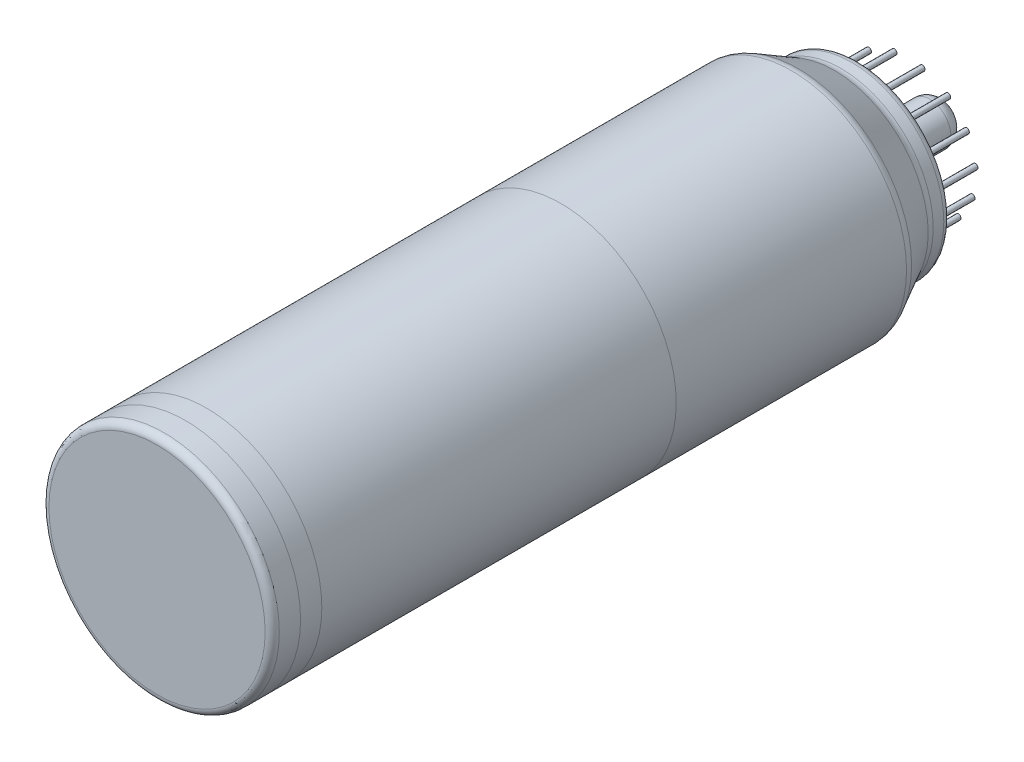
ISO-10303-21;
HEADER;
FILE_DESCRIPTION(('STEP AP214'),'2;1');
FILE_NAME('part.step','',(''),(''),'','','');
FILE_SCHEMA(('AUTOMOTIVE_DESIGN { 1 0 10303 214 1 1 1 1 }'));
ENDSEC;
DATA;
#1=APPLICATION_CONTEXT('core data for automotive mechanical design processes');
#2=APPLICATION_PROTOCOL_DEFINITION('international standard','automotive_design',2000,#1);
#3=PRODUCT_CONTEXT('',#1,'mechanical');
#4=PRODUCT('Part','Part','',(#3));
#5=PRODUCT_RELATED_PRODUCT_CATEGORY('part','',(#4));
#6=PRODUCT_DEFINITION_FORMATION('','',#4);
#7=PRODUCT_DEFINITION_CONTEXT('part definition',#1,'design');
#8=PRODUCT_DEFINITION('design','',#6,#7);
#9=PRODUCT_DEFINITION_SHAPE('','',#8);
#10=(LENGTH_UNIT() NAMED_UNIT(*) SI_UNIT(.MILLI.,.METRE.));
#11=(NAMED_UNIT(*) PLANE_ANGLE_UNIT() SI_UNIT($,.RADIAN.));
#12=(NAMED_UNIT(*) SI_UNIT($,.STERADIAN.) SOLID_ANGLE_UNIT());
#13=UNCERTAINTY_MEASURE_WITH_UNIT(LENGTH_MEASURE(1.E-05),#10,'distance_accuracy_value','');
#14=(GEOMETRIC_REPRESENTATION_CONTEXT(3) GLOBAL_UNCERTAINTY_ASSIGNED_CONTEXT((#13)) GLOBAL_UNIT_ASSIGNED_CONTEXT((#10,
#11,#12)) REPRESENTATION_CONTEXT('',''));
#15=CARTESIAN_POINT('',(0.,0.,0.));
#16=DIRECTION('',(0.,0.,1.));
#17=DIRECTION('',(1.,0.,0.));
#18=AXIS2_PLACEMENT_3D('',#15,#16,#17);
#19=CARTESIAN_POINT('',(0.,0.,-111.));
#20=DIRECTION('',(0.,0.,1.));
#21=DIRECTION('',(1.,0.,0.));
#22=AXIS2_PLACEMENT_3D('',#19,#20,#21);
#23=CYLINDRICAL_SURFACE('',#22,16.25);
#24=CARTESIAN_POINT('',(0.,0.,-89.4931249033981));
#25=DIRECTION('',(0.,0.,-1.));
#26=DIRECTION('',(-1.,0.,0.));
#27=AXIS2_PLACEMENT_3D('',#24,#25,#26);
#28=CIRCLE('',#27,16.25);
#29=CARTESIAN_POINT('',(-16.25,0.,-89.4931249033981));
#30=VERTEX_POINT('',#29);
#31=EDGE_CURVE('E167',#30,#30,#28,.F.);
#32=ORIENTED_EDGE('',*,*,#31,.T.);
#33=EDGE_LOOP('',(#32));
#34=FACE_BOUND('',#33,.T.);
#35=CARTESIAN_POINT('',(0.,0.,-57.));
#36=DIRECTION('',(0.,0.,1.));
#37=DIRECTION('',(1.,0.,0.));
#38=AXIS2_PLACEMENT_3D('',#35,#36,#37);
#39=CIRCLE('',#38,16.25);
#40=CARTESIAN_POINT('',(16.25,0.,-57.));
#41=VERTEX_POINT('',#40);
#42=CARTESIAN_POINT('',(-16.25,0.,-57.));
#43=VERTEX_POINT('',#42);
#44=EDGE_CURVE('E11',#41,#43,#39,.T.);
#45=ORIENTED_EDGE('',*,*,#44,.F.);
#46=EDGE_CURVE('E46',#43,#41,#39,.T.);
#47=ORIENTED_EDGE('',*,*,#46,.F.);
#48=EDGE_LOOP('',(#45,#47));
#49=FACE_BOUND('',#48,.T.);
#50=ADVANCED_FACE('F42',(#34,#49),#23,.T.);
#51=CARTESIAN_POINT('',(0.,0.,-4.));
#52=DIRECTION('',(0.,0.,-1.));
#53=DIRECTION('',(-1.,0.,0.));
#54=AXIS2_PLACEMENT_3D('',#51,#52,#53);
#55=CIRCLE('',#54,16.25);
#56=CARTESIAN_POINT('',(16.25,0.,-4.));
#57=VERTEX_POINT('',#56);
#58=CARTESIAN_POINT('',(-16.25,0.,-4.00000000000001));
#59=VERTEX_POINT('',#58);
#60=EDGE_CURVE('E76',#57,#59,#55,.T.);
#61=ORIENTED_EDGE('',*,*,#60,.T.);
#62=EDGE_CURVE('E72',#59,#57,#55,.T.);
#63=ORIENTED_EDGE('',*,*,#62,.T.);
#64=EDGE_LOOP('',(#61,#63));
#65=FACE_BOUND('',#64,.T.);
#66=CARTESIAN_POINT('',(0.,0.,-6.99999999999999));
#67=DIRECTION('',(0.,0.,-1.));
#68=DIRECTION('',(-1.,0.,0.));
#69=AXIS2_PLACEMENT_3D('',#66,#67,#68);
#70=CIRCLE('',#69,16.25);
#71=CARTESIAN_POINT('',(-16.25,0.,-6.99999999999999));
#72=VERTEX_POINT('',#71);
#73=CARTESIAN_POINT('',(16.25,0.,-7.));
#74=VERTEX_POINT('',#73);
#75=EDGE_CURVE('E92',#72,#74,#70,.T.);
#76=ORIENTED_EDGE('',*,*,#75,.F.);
#77=EDGE_CURVE('E79',#74,#72,#70,.T.);
#78=ORIENTED_EDGE('',*,*,#77,.F.);
#79=EDGE_LOOP('',(#76,#78));
#80=FACE_BOUND('',#79,.T.);
#81=ADVANCED_FACE('F74',(#65,#80),#23,.T.);
#82=CARTESIAN_POINT('',(0.,0.,-1.));
#83=DIRECTION('',(0.,0.,-1.));
#84=DIRECTION('',(-1.,0.,0.));
#85=AXIS2_PLACEMENT_3D('',#82,#83,#84);
#86=CIRCLE('',#85,16.25);
#87=CARTESIAN_POINT('',(-16.25,0.,-1.));
#88=VERTEX_POINT('',#87);
#89=EDGE_CURVE('E128',#88,#88,#86,.T.);
#90=ORIENTED_EDGE('',*,*,#89,.T.);
#91=EDGE_LOOP('',(#90));
#92=FACE_BOUND('',#91,.T.);
#93=ORIENTED_EDGE('',*,*,#62,.F.);
#94=ORIENTED_EDGE('',*,*,#60,.F.);
#95=EDGE_LOOP('',(#93,#94));
#96=FACE_BOUND('',#95,.T.);
#97=ADVANCED_FACE('F81',(#92,#96),#23,.T.);
#98=CARTESIAN_POINT('',(0.,0.,0.));
#99=DIRECTION('',(0.,0.,-1.));
#100=DIRECTION('',(-1.,0.,0.));
#101=AXIS2_PLACEMENT_3D('',#98,#99,#100);
#102=PLANE('',#101);
#103=CARTESIAN_POINT('',(0.,0.,0.));
#104=DIRECTION('',(0.,0.,-1.));
#105=DIRECTION('',(-1.,0.,0.));
#106=AXIS2_PLACEMENT_3D('',#103,#104,#105);
#107=CIRCLE('',#106,15.25);
#108=CARTESIAN_POINT('',(-15.25,0.,0.));
#109=VERTEX_POINT('',#108);
#110=EDGE_CURVE('E132',#109,#109,#107,.F.);
#111=ORIENTED_EDGE('',*,*,#110,.T.);
#112=EDGE_LOOP('',(#111));
#113=FACE_BOUND('',#112,.T.);
#114=ADVANCED_FACE('F113',(#113),#102,.F.);
#115=ORIENTED_EDGE('',*,*,#46,.T.);
#116=ORIENTED_EDGE('',*,*,#44,.T.);
#117=EDGE_LOOP('',(#115,#116));
#118=FACE_BOUND('',#117,.T.);
#119=ORIENTED_EDGE('',*,*,#77,.T.);
#120=ORIENTED_EDGE('',*,*,#75,.T.);
#121=EDGE_LOOP('',(#119,#120));
#122=FACE_BOUND('',#121,.T.);
#123=ADVANCED_FACE('F100',(#118,#122),#23,.T.);
#124=CARTESIAN_POINT('',(0.,0.,-96.));
#125=DIRECTION('',(0.,0.,1.));
#126=DIRECTION('',(1.,0.,0.));
#127=AXIS2_PLACEMENT_3D('',#124,#125,#126);
#128=CONICAL_SURFACE('',#127,13.,0.496422753404882);
#129=CARTESIAN_POINT('',(0.,0.,-95.5543087995204));
#130=DIRECTION('',(0.,0.,1.));
#131=DIRECTION('',(1.,0.,0.));
#132=AXIS2_PLACEMENT_3D('',#129,#130,#131);
#133=CIRCLE('',#132,13.2414160669265);
#134=CARTESIAN_POINT('',(13.2414160669265,0.,-95.5543087995204));
#135=VERTEX_POINT('',#134);
#136=EDGE_CURVE('E159',#135,#135,#133,.T.);
#137=ORIENTED_EDGE('',*,*,#136,.T.);
#138=EDGE_LOOP('',(#137));
#139=FACE_BOUND('',#138,.T.);
#140=CARTESIAN_POINT('',(0.,0.,-90.4456912004796));
#141=DIRECTION('',(0.,0.,-1.));
#142=DIRECTION('',(-1.,0.,0.));
#143=AXIS2_PLACEMENT_3D('',#140,#141,#142);
#144=CIRCLE('',#143,16.0085839330735);
#145=CARTESIAN_POINT('',(-16.0085839330735,0.,-90.4456912004796));
#146=VERTEX_POINT('',#145);
#147=EDGE_CURVE('E155',#146,#146,#144,.T.);
#148=ORIENTED_EDGE('',*,*,#147,.T.);
#149=EDGE_LOOP('',(#148));
#150=FACE_BOUND('',#149,.T.);
#151=ADVANCED_FACE('F112',(#139,#150),#128,.T.);
#152=CARTESIAN_POINT('',(0.,0.,-111.));
#153=DIRECTION('',(0.,0.,1.));
#154=DIRECTION('',(1.,0.,0.));
#155=AXIS2_PLACEMENT_3D('',#152,#153,#154);
#156=CYLINDRICAL_SURFACE('',#155,13.);
#157=CARTESIAN_POINT('',(0.,0.,-96.5068750966019));
#158=DIRECTION('',(0.,0.,1.));
#159=DIRECTION('',(1.,0.,0.));
#160=AXIS2_PLACEMENT_3D('',#157,#158,#159);
#161=CIRCLE('',#160,13.);
#162=CARTESIAN_POINT('',(13.,0.,-96.5068750966019));
#163=VERTEX_POINT('',#162);
#164=EDGE_CURVE('E163',#163,#163,#161,.F.);
#165=ORIENTED_EDGE('',*,*,#164,.T.);
#166=EDGE_LOOP('',(#165));
#167=FACE_BOUND('',#166,.T.);
#168=CARTESIAN_POINT('',(0.,0.,-98.));
#169=DIRECTION('',(0.,0.,1.));
#170=DIRECTION('',(1.,0.,0.));
#171=AXIS2_PLACEMENT_3D('',#168,#169,#170);
#172=CIRCLE('',#171,13.);
#173=CARTESIAN_POINT('',(13.,0.,-98.));
#174=VERTEX_POINT('',#173);
#175=EDGE_CURVE('E259',#174,#174,#172,.T.);
#176=ORIENTED_EDGE('',*,*,#175,.T.);
#177=EDGE_LOOP('',(#176));
#178=FACE_BOUND('',#177,.T.);
#179=ADVANCED_FACE('F118',(#167,#178),#156,.T.);
#180=CARTESIAN_POINT('',(0.,13.,-99.));
#181=DIRECTION('',(0.,0.,1.));
#182=DIRECTION('',(1.,0.,0.));
#183=AXIS2_PLACEMENT_3D('',#180,#181,#182);
#184=PLANE('',#183);
#185=CARTESIAN_POINT('',(3.86399810922005,-8.67868184760473,-99.));
#186=DIRECTION('',(0.,0.,1.));
#187=DIRECTION('',(1.,0.,0.));
#188=AXIS2_PLACEMENT_3D('',#185,#186,#187);
#189=CIRCLE('',#188,0.374999999999999);
#190=CARTESIAN_POINT('',(4.23899810922005,-8.67868184760473,-99.));
#191=VERTEX_POINT('',#190);
#192=EDGE_CURVE('E83',#191,#191,#189,.F.);
#193=ORIENTED_EDGE('',*,*,#192,.F.);
#194=EDGE_LOOP('',(#193));
#195=FACE_BOUND('',#194,.T.);
#196=CARTESIAN_POINT('',(7.05987584203522,-6.35674076040919,-99.));
#197=DIRECTION('',(0.,0.,1.));
#198=DIRECTION('',(1.,0.,0.));
#199=AXIS2_PLACEMENT_3D('',#196,#197,#198);
#200=CIRCLE('',#199,0.374999999999999);
#201=CARTESIAN_POINT('',(7.43487584203522,-6.35674076040919,-99.));
#202=VERTEX_POINT('',#201);
#203=EDGE_CURVE('E87',#202,#202,#200,.F.);
#204=ORIENTED_EDGE('',*,*,#203,.F.);
#205=EDGE_LOOP('',(#204));
#206=FACE_BOUND('',#205,.T.);
#207=CARTESIAN_POINT('',(9.03503690480395,-2.93566144656204,-99.));
#208=DIRECTION('',(0.,0.,1.));
#209=DIRECTION('',(1.,0.,0.));
#210=AXIS2_PLACEMENT_3D('',#207,#208,#209);
#211=CIRCLE('',#210,0.374999999999999);
#212=CARTESIAN_POINT('',(9.41003690480395,-2.93566144656204,-99.));
#213=VERTEX_POINT('',#212);
#214=EDGE_CURVE('E214',#213,#213,#211,.F.);
#215=ORIENTED_EDGE('',*,*,#214,.F.);
#216=EDGE_LOOP('',(#215));
#217=FACE_BOUND('',#216,.T.);
#218=CARTESIAN_POINT('',(9.4479580059986,0.993020401042676,-99.));
#219=DIRECTION('',(0.,0.,1.));
#220=DIRECTION('',(1.,0.,0.));
#221=AXIS2_PLACEMENT_3D('',#218,#219,#220);
#222=CIRCLE('',#221,0.374999999999999);
#223=CARTESIAN_POINT('',(9.8229580059986,0.993020401042676,-99.));
#224=VERTEX_POINT('',#223);
#225=EDGE_CURVE('E210',#224,#224,#222,.F.);
#226=ORIENTED_EDGE('',*,*,#225,.F.);
#227=EDGE_LOOP('',(#226));
#228=FACE_BOUND('',#227,.T.);
#229=CARTESIAN_POINT('',(8.22724133595218,4.74999999999998,-99.));
#230=DIRECTION('',(0.,0.,1.));
#231=DIRECTION('',(1.,0.,0.));
#232=AXIS2_PLACEMENT_3D('',#229,#230,#231);
#233=CIRCLE('',#232,0.374999999999999);
#234=CARTESIAN_POINT('',(8.60224133595218,4.74999999999998,-99.));
#235=VERTEX_POINT('',#234);
#236=EDGE_CURVE('E206',#235,#235,#233,.F.);
#237=ORIENTED_EDGE('',*,*,#236,.F.);
#238=EDGE_LOOP('',(#237));
#239=FACE_BOUND('',#238,.T.);
#240=CARTESIAN_POINT('',(5.5839598967785,7.68566144656199,-99.));
#241=DIRECTION('',(0.,0.,1.));
#242=DIRECTION('',(1.,0.,0.));
#243=AXIS2_PLACEMENT_3D('',#240,#241,#242);
#244=CIRCLE('',#243,0.374999999999999);
#245=CARTESIAN_POINT('',(5.9589598967785,7.68566144656199,-99.));
#246=VERTEX_POINT('',#245);
#247=EDGE_CURVE('E202',#246,#246,#244,.F.);
#248=ORIENTED_EDGE('',*,*,#247,.F.);
#249=EDGE_LOOP('',(#248));
#250=FACE_BOUND('',#249,.T.);
#251=CARTESIAN_POINT('',(1.97516106276872,9.29240220697115,-99.));
#252=DIRECTION('',(0.,0.,1.));
#253=DIRECTION('',(1.,0.,0.));
#254=AXIS2_PLACEMENT_3D('',#251,#252,#253);
#255=CIRCLE('',#254,0.374999999999999);
#256=CARTESIAN_POINT('',(2.35016106276872,9.29240220697115,-99.));
#257=VERTEX_POINT('',#256);
#258=EDGE_CURVE('E198',#257,#257,#255,.F.);
#259=ORIENTED_EDGE('',*,*,#258,.F.);
#260=EDGE_LOOP('',(#259));
#261=FACE_BOUND('',#260,.T.);
#262=CARTESIAN_POINT('',(-1.97516106276872,9.29240220697115,-99.));
#263=DIRECTION('',(0.,0.,1.));
#264=DIRECTION('',(1.,0.,0.));
#265=AXIS2_PLACEMENT_3D('',#262,#263,#264);
#266=CIRCLE('',#265,0.374999999999999);
#267=CARTESIAN_POINT('',(-1.60016106276872,9.29240220697115,-99.));
#268=VERTEX_POINT('',#267);
#269=EDGE_CURVE('E194',#268,#268,#266,.F.);
#270=ORIENTED_EDGE('',*,*,#269,.F.);
#271=EDGE_LOOP('',(#270));
#272=FACE_BOUND('',#271,.T.);
#273=CARTESIAN_POINT('',(-5.58395989677851,7.685661446562,-99.));
#274=DIRECTION('',(0.,0.,1.));
#275=DIRECTION('',(1.,0.,0.));
#276=AXIS2_PLACEMENT_3D('',#273,#274,#275);
#277=CIRCLE('',#276,0.374999999999999);
#278=CARTESIAN_POINT('',(-5.20895989677851,7.685661446562,-99.));
#279=VERTEX_POINT('',#278);
#280=EDGE_CURVE('E190',#279,#279,#277,.F.);
#281=ORIENTED_EDGE('',*,*,#280,.F.);
#282=EDGE_LOOP('',(#281));
#283=FACE_BOUND('',#282,.T.);
#284=CARTESIAN_POINT('',(-8.22724133595218,4.74999999999998,-99.));
#285=DIRECTION('',(0.,0.,1.));
#286=DIRECTION('',(1.,0.,0.));
#287=AXIS2_PLACEMENT_3D('',#284,#285,#286);
#288=CIRCLE('',#287,0.374999999999999);
#289=CARTESIAN_POINT('',(-7.85224133595218,4.74999999999998,-99.));
#290=VERTEX_POINT('',#289);
#291=EDGE_CURVE('E186',#290,#290,#288,.F.);
#292=ORIENTED_EDGE('',*,*,#291,.F.);
#293=EDGE_LOOP('',(#292));
#294=FACE_BOUND('',#293,.T.);
#295=CARTESIAN_POINT('',(-9.4479580059986,0.993020401042677,-99.));
#296=DIRECTION('',(0.,0.,1.));
#297=DIRECTION('',(1.,0.,0.));
#298=AXIS2_PLACEMENT_3D('',#295,#296,#297);
#299=CIRCLE('',#298,0.374999999999999);
#300=CARTESIAN_POINT('',(-9.0729580059986,0.993020401042677,-99.));
#301=VERTEX_POINT('',#300);
#302=EDGE_CURVE('E182',#301,#301,#299,.F.);
#303=ORIENTED_EDGE('',*,*,#302,.F.);
#304=EDGE_LOOP('',(#303));
#305=FACE_BOUND('',#304,.T.);
#306=CARTESIAN_POINT('',(-9.03503690480395,-2.93566144656204,-99.));
#307=DIRECTION('',(0.,0.,1.));
#308=DIRECTION('',(1.,0.,0.));
#309=AXIS2_PLACEMENT_3D('',#306,#307,#308);
#310=CIRCLE('',#309,0.374999999999999);
#311=CARTESIAN_POINT('',(-8.66003690480395,-2.93566144656204,-99.));
#312=VERTEX_POINT('',#311);
#313=EDGE_CURVE('E178',#312,#312,#310,.F.);
#314=ORIENTED_EDGE('',*,*,#313,.F.);
#315=EDGE_LOOP('',(#314));
#316=FACE_BOUND('',#315,.T.);
#317=CARTESIAN_POINT('',(-7.05987584203521,-6.35674076040919,-99.));
#318=DIRECTION('',(0.,0.,1.));
#319=DIRECTION('',(1.,0.,0.));
#320=AXIS2_PLACEMENT_3D('',#317,#318,#319);
#321=CIRCLE('',#320,0.374999999999999);
#322=CARTESIAN_POINT('',(-6.68487584203521,-6.35674076040919,-99.));
#323=VERTEX_POINT('',#322);
#324=EDGE_CURVE('E174',#323,#323,#321,.F.);
#325=ORIENTED_EDGE('',*,*,#324,.F.);
#326=EDGE_LOOP('',(#325));
#327=FACE_BOUND('',#326,.T.);
#328=CARTESIAN_POINT('',(-3.86399810922005,-8.67868184760473,-99.));
#329=DIRECTION('',(0.,0.,1.));
#330=DIRECTION('',(1.,0.,0.));
#331=AXIS2_PLACEMENT_3D('',#328,#329,#330);
#332=CIRCLE('',#331,0.374999999999999);
#333=CARTESIAN_POINT('',(-3.48899810922005,-8.67868184760473,-99.));
#334=VERTEX_POINT('',#333);
#335=EDGE_CURVE('E170',#334,#334,#332,.F.);
#336=ORIENTED_EDGE('',*,*,#335,.F.);
#337=EDGE_LOOP('',(#336));
#338=FACE_BOUND('',#337,.T.);
#339=CARTESIAN_POINT('',(0.,0.,-99.));
#340=DIRECTION('',(0.,0.,1.));
#341=DIRECTION('',(1.,0.,0.));
#342=AXIS2_PLACEMENT_3D('',#339,#340,#341);
#343=CIRCLE('',#342,5.);
#344=CARTESIAN_POINT('',(5.,0.,-99.));
#345=VERTEX_POINT('',#344);
#346=EDGE_CURVE('E131',#345,#345,#343,.T.);
#347=ORIENTED_EDGE('',*,*,#346,.T.);
#348=EDGE_LOOP('',(#347));
#349=FACE_BOUND('',#348,.T.);
#350=CARTESIAN_POINT('',(0.,0.,-99.));
#351=DIRECTION('',(0.,0.,1.));
#352=DIRECTION('',(1.,0.,0.));
#353=AXIS2_PLACEMENT_3D('',#350,#351,#352);
#354=CIRCLE('',#353,12.);
#355=CARTESIAN_POINT('',(12.,0.,-99.));
#356=VERTEX_POINT('',#355);
#357=EDGE_CURVE('E140',#356,#356,#354,.F.);
#358=ORIENTED_EDGE('',*,*,#357,.T.);
#359=EDGE_LOOP('',(#358));
#360=FACE_BOUND('',#359,.T.);
#361=ADVANCED_FACE('F223',(#195,#206,#217,#228,#239,#250,#261,#272,#283,#294,#305,#316,#327,
#338,#349,#360),#184,.F.);
#362=CARTESIAN_POINT('',(0.,0.,-111.));
#363=DIRECTION('',(0.,0.,1.));
#364=DIRECTION('',(1.,0.,0.));
#365=AXIS2_PLACEMENT_3D('',#362,#363,#364);
#366=CYLINDRICAL_SURFACE('',#365,3.);
#367=CARTESIAN_POINT('',(0.,0.,-101.));
#368=DIRECTION('',(0.,0.,1.));
#369=DIRECTION('',(1.,0.,0.));
#370=AXIS2_PLACEMENT_3D('',#367,#368,#369);
#371=CIRCLE('',#370,3.);
#372=CARTESIAN_POINT('',(3.,0.,-101.));
#373=VERTEX_POINT('',#372);
#374=EDGE_CURVE('E147',#373,#373,#371,.F.);
#375=ORIENTED_EDGE('',*,*,#374,.T.);
#376=EDGE_LOOP('',(#375));
#377=FACE_BOUND('',#376,.T.);
#378=CARTESIAN_POINT('',(0.,0.,-109.));
#379=DIRECTION('',(0.,0.,1.));
#380=DIRECTION('',(1.,0.,0.));
#381=AXIS2_PLACEMENT_3D('',#378,#379,#380);
#382=CIRCLE('',#381,3.);
#383=CARTESIAN_POINT('',(3.,0.,-109.));
#384=VERTEX_POINT('',#383);
#385=EDGE_CURVE('E137',#384,#384,#382,.T.);
#386=ORIENTED_EDGE('',*,*,#385,.T.);
#387=EDGE_LOOP('',(#386));
#388=FACE_BOUND('',#387,.T.);
#389=ADVANCED_FACE('F226',(#377,#388),#366,.T.);
#390=CARTESIAN_POINT('',(0.,3.,-111.));
#391=DIRECTION('',(0.,0.,1.));
#392=DIRECTION('',(1.,0.,0.));
#393=AXIS2_PLACEMENT_3D('',#390,#391,#392);
#394=PLANE('',#393);
#395=CARTESIAN_POINT('',(0.,0.,-111.));
#396=DIRECTION('',(0.,0.,1.));
#397=DIRECTION('',(1.,0.,0.));
#398=AXIS2_PLACEMENT_3D('',#395,#396,#397);
#399=CIRCLE('',#398,1.);
#400=CARTESIAN_POINT('',(1.,0.,-111.));
#401=VERTEX_POINT('',#400);
#402=EDGE_CURVE('E151',#401,#401,#399,.F.);
#403=ORIENTED_EDGE('',*,*,#402,.T.);
#404=EDGE_LOOP('',(#403));
#405=FACE_BOUND('',#404,.T.);
#406=ADVANCED_FACE('F436',(#405),#394,.F.);
#407=CARTESIAN_POINT('',(0.,0.,-98.));
#408=DIRECTION('',(0.,0.,1.));
#409=DIRECTION('',(1.,0.,0.));
#410=AXIS2_PLACEMENT_3D('',#407,#408,#409);
#411=TOROIDAL_SURFACE('',#410,12.,1.);
#412=ORIENTED_EDGE('',*,*,#357,.F.);
#413=EDGE_LOOP('',(#412));
#414=FACE_BOUND('',#413,.T.);
#415=ORIENTED_EDGE('',*,*,#175,.F.);
#416=EDGE_LOOP('',(#415));
#417=FACE_BOUND('',#416,.T.);
#418=ADVANCED_FACE('F439',(#414,#417),#411,.T.);
#419=CARTESIAN_POINT('',(0.,0.,-1.));
#420=DIRECTION('',(0.,0.,-1.));
#421=DIRECTION('',(-1.,0.,0.));
#422=AXIS2_PLACEMENT_3D('',#419,#420,#421);
#423=TOROIDAL_SURFACE('',#422,15.25,1.);
#424=ORIENTED_EDGE('',*,*,#89,.F.);
#425=EDGE_LOOP('',(#424));
#426=FACE_BOUND('',#425,.T.);
#427=ORIENTED_EDGE('',*,*,#110,.F.);
#428=EDGE_LOOP('',(#427));
#429=FACE_BOUND('',#428,.T.);
#430=ADVANCED_FACE('F453',(#426,#429),#423,.T.);
#431=CARTESIAN_POINT('',(0.,0.,-101.));
#432=DIRECTION('',(0.,0.,1.));
#433=DIRECTION('',(1.,0.,0.));
#434=AXIS2_PLACEMENT_3D('',#431,#432,#433);
#435=TOROIDAL_SURFACE('',#434,5.,2.);
#436=ORIENTED_EDGE('',*,*,#374,.F.);
#437=EDGE_LOOP('',(#436));
#438=FACE_BOUND('',#437,.T.);
#439=ORIENTED_EDGE('',*,*,#346,.F.);
#440=EDGE_LOOP('',(#439));
#441=FACE_BOUND('',#440,.T.);
#442=ADVANCED_FACE('F458',(#438,#441),#435,.F.);
#443=CARTESIAN_POINT('',(0.,0.,-109.));
#444=DIRECTION('',(0.,0.,1.));
#445=DIRECTION('',(1.,0.,0.));
#446=AXIS2_PLACEMENT_3D('',#443,#444,#445);
#447=DEGENERATE_TOROIDAL_SURFACE('',#446,1.,2.,.T.);
#448=ORIENTED_EDGE('',*,*,#402,.F.);
#449=EDGE_LOOP('',(#448));
#450=FACE_BOUND('',#449,.T.);
#451=ORIENTED_EDGE('',*,*,#385,.F.);
#452=EDGE_LOOP('',(#451));
#453=FACE_BOUND('',#452,.T.);
#454=ADVANCED_FACE('F463',(#450,#453),#447,.T.);
#455=CARTESIAN_POINT('',(0.,0.,-96.5068750966019));
#456=DIRECTION('',(0.,0.,1.));
#457=DIRECTION('',(1.,0.,0.));
#458=AXIS2_PLACEMENT_3D('',#455,#456,#457);
#459=TOROIDAL_SURFACE('',#458,15.,2.);
#460=ORIENTED_EDGE('',*,*,#164,.F.);
#461=EDGE_LOOP('',(#460));
#462=FACE_BOUND('',#461,.T.);
#463=ORIENTED_EDGE('',*,*,#136,.F.);
#464=EDGE_LOOP('',(#463));
#465=FACE_BOUND('',#464,.T.);
#466=ADVANCED_FACE('F466',(#462,#465),#459,.F.);
#467=CARTESIAN_POINT('',(0.,0.,-89.4931249033981));
#468=DIRECTION('',(0.,0.,-1.));
#469=DIRECTION('',(-1.,0.,0.));
#470=AXIS2_PLACEMENT_3D('',#467,#468,#469);
#471=TOROIDAL_SURFACE('',#470,14.25,2.);
#472=ORIENTED_EDGE('',*,*,#147,.F.);
#473=EDGE_LOOP('',(#472));
#474=FACE_BOUND('',#473,.T.);
#475=ORIENTED_EDGE('',*,*,#31,.F.);
#476=EDGE_LOOP('',(#475));
#477=FACE_BOUND('',#476,.T.);
#478=ADVANCED_FACE('F44',(#474,#477),#471,.T.);
#479=CARTESIAN_POINT('',(-3.86399810922005,-8.67868184760473,-106.));
#480=DIRECTION('',(0.,0.,1.));
#481=DIRECTION('',(1.,0.,0.));
#482=AXIS2_PLACEMENT_3D('',#479,#480,#481);
#483=CYLINDRICAL_SURFACE('',#482,0.374999999999999);
#484=CARTESIAN_POINT('',(-3.86399810922005,-8.67868184760473,-106.));
#485=DIRECTION('',(0.,0.,-1.));
#486=DIRECTION('',(-1.,0.,0.));
#487=AXIS2_PLACEMENT_3D('',#484,#485,#486);
#488=CIRCLE('',#487,0.374999999999999);
#489=CARTESIAN_POINT('',(-4.23899810922005,-8.67868184760473,-106.));
#490=VERTEX_POINT('',#489);
#491=EDGE_CURVE('E262',#490,#490,#488,.T.);
#492=ORIENTED_EDGE('',*,*,#491,.F.);
#493=EDGE_LOOP('',(#492));
#494=FACE_BOUND('',#493,.T.);
#495=ORIENTED_EDGE('',*,*,#335,.T.);
#496=EDGE_LOOP('',(#495));
#497=FACE_BOUND('',#496,.T.);
#498=ADVANCED_FACE('F431',(#494,#497),#483,.T.);
#499=CARTESIAN_POINT('',(-3.86399810922005,-8.67868184760473,-106.));
#500=DIRECTION('',(0.,0.,-1.));
#501=DIRECTION('',(-1.,0.,0.));
#502=AXIS2_PLACEMENT_3D('',#499,#500,#501);
#503=PLANE('',#502);
#504=ORIENTED_EDGE('',*,*,#491,.T.);
#505=EDGE_LOOP('',(#504));
#506=FACE_BOUND('',#505,.T.);
#507=ADVANCED_FACE('F427',(#506),#503,.T.);
#508=CARTESIAN_POINT('',(-7.05987584203521,-6.35674076040919,-106.));
#509=DIRECTION('',(0.,0.,1.));
#510=DIRECTION('',(0.913545457642601,-0.406736643075801,0.));
#511=AXIS2_PLACEMENT_3D('',#508,#509,#510);
#512=CYLINDRICAL_SURFACE('',#511,0.374999999999999);
#513=CARTESIAN_POINT('',(-7.05987584203521,-6.35674076040919,-106.));
#514=DIRECTION('',(0.,0.,-1.));
#515=DIRECTION('',(-0.913545457642601,0.406736643075801,0.));
#516=AXIS2_PLACEMENT_3D('',#513,#514,#515);
#517=CIRCLE('',#516,0.374999999999999);
#518=CARTESIAN_POINT('',(-7.40245538865119,-6.20421451925576,-106.));
#519=VERTEX_POINT('',#518);
#520=EDGE_CURVE('E268',#519,#519,#517,.T.);
#521=ORIENTED_EDGE('',*,*,#520,.F.);
#522=EDGE_LOOP('',(#521));
#523=FACE_BOUND('',#522,.T.);
#524=ORIENTED_EDGE('',*,*,#324,.T.);
#525=EDGE_LOOP('',(#524));
#526=FACE_BOUND('',#525,.T.);
#527=ADVANCED_FACE('F423',(#523,#526),#512,.T.);
#528=CARTESIAN_POINT('',(-7.05987584203521,-6.35674076040919,-106.));
#529=DIRECTION('',(0.,0.,-1.));
#530=DIRECTION('',(-0.913545457642601,0.406736643075801,0.));
#531=AXIS2_PLACEMENT_3D('',#528,#529,#530);
#532=PLANE('',#531);
#533=ORIENTED_EDGE('',*,*,#520,.T.);
#534=EDGE_LOOP('',(#533));
#535=FACE_BOUND('',#534,.T.);
#536=ADVANCED_FACE('F419',(#535),#532,.T.);
#537=CARTESIAN_POINT('',(-9.03503690480395,-2.93566144656204,-106.));
#538=DIRECTION('',(0.,0.,1.));
#539=DIRECTION('',(0.669130606358857,-0.743144825477395,0.));
#540=AXIS2_PLACEMENT_3D('',#537,#538,#539);
#541=CYLINDRICAL_SURFACE('',#540,0.374999999999999);
#542=CARTESIAN_POINT('',(-9.03503690480395,-2.93566144656204,-106.));
#543=DIRECTION('',(0.,0.,-1.));
#544=DIRECTION('',(-0.669130606358857,0.743144825477395,0.));
#545=AXIS2_PLACEMENT_3D('',#542,#543,#544);
#546=CIRCLE('',#545,0.374999999999999);
#547=CARTESIAN_POINT('',(-9.28596088218852,-2.65698213700802,-106.));
#548=VERTEX_POINT('',#547);
#549=EDGE_CURVE('E272',#548,#548,#546,.T.);
#550=ORIENTED_EDGE('',*,*,#549,.F.);
#551=EDGE_LOOP('',(#550));
#552=FACE_BOUND('',#551,.T.);
#553=ORIENTED_EDGE('',*,*,#313,.T.);
#554=EDGE_LOOP('',(#553));
#555=FACE_BOUND('',#554,.T.);
#556=ADVANCED_FACE('F415',(#552,#555),#541,.T.);
#557=CARTESIAN_POINT('',(-9.03503690480395,-2.93566144656204,-106.));
#558=DIRECTION('',(0.,0.,-1.));
#559=DIRECTION('',(-0.669130606358857,0.743144825477395,0.));
#560=AXIS2_PLACEMENT_3D('',#557,#558,#559);
#561=PLANE('',#560);
#562=ORIENTED_EDGE('',*,*,#549,.T.);
#563=EDGE_LOOP('',(#562));
#564=FACE_BOUND('',#563,.T.);
#565=ADVANCED_FACE('F411',(#564),#561,.T.);
#566=CARTESIAN_POINT('',(-9.4479580059986,0.993020401042677,-106.));
#567=DIRECTION('',(0.,0.,1.));
#568=DIRECTION('',(0.309016994374945,-0.951056516295154,0.));
#569=AXIS2_PLACEMENT_3D('',#566,#567,#568);
#570=CYLINDRICAL_SURFACE('',#569,0.374999999999999);
#571=CARTESIAN_POINT('',(-9.4479580059986,0.993020401042677,-106.));
#572=DIRECTION('',(0.,0.,-1.));
#573=DIRECTION('',(-0.309016994374945,0.951056516295154,0.));
#574=AXIS2_PLACEMENT_3D('',#571,#572,#573);
#575=CIRCLE('',#574,0.374999999999999);
#576=CARTESIAN_POINT('',(-9.5638393788892,1.34966659465336,-106.));
#577=VERTEX_POINT('',#576);
#578=EDGE_CURVE('E276',#577,#577,#575,.T.);
#579=ORIENTED_EDGE('',*,*,#578,.F.);
#580=EDGE_LOOP('',(#579));
#581=FACE_BOUND('',#580,.T.);
#582=ORIENTED_EDGE('',*,*,#302,.T.);
#583=EDGE_LOOP('',(#582));
#584=FACE_BOUND('',#583,.T.);
#585=ADVANCED_FACE('F407',(#581,#584),#570,.T.);
#586=CARTESIAN_POINT('',(-9.4479580059986,0.993020401042677,-106.));
#587=DIRECTION('',(0.,0.,-1.));
#588=DIRECTION('',(-0.309016994374945,0.951056516295154,0.));
#589=AXIS2_PLACEMENT_3D('',#586,#587,#588);
#590=PLANE('',#589);
#591=ORIENTED_EDGE('',*,*,#578,.T.);
#592=EDGE_LOOP('',(#591));
#593=FACE_BOUND('',#592,.T.);
#594=ADVANCED_FACE('F403',(#593),#590,.T.);
#595=CARTESIAN_POINT('',(-8.22724133595218,4.74999999999998,-106.));
#596=DIRECTION('',(0.,0.,1.));
#597=DIRECTION('',(-0.104528463267657,-0.994521895368273,0.));
#598=AXIS2_PLACEMENT_3D('',#595,#596,#597);
#599=CYLINDRICAL_SURFACE('',#598,0.374999999999999);
#600=CARTESIAN_POINT('',(-8.22724133595218,4.74999999999998,-106.));
#601=DIRECTION('',(0.,0.,-1.));
#602=DIRECTION('',(0.104528463267657,0.994521895368273,0.));
#603=AXIS2_PLACEMENT_3D('',#600,#601,#602);
#604=CIRCLE('',#603,0.374999999999999);
#605=CARTESIAN_POINT('',(-8.18804316222681,5.12294571076308,-106.));
#606=VERTEX_POINT('',#605);
#607=EDGE_CURVE('E280',#606,#606,#604,.T.);
#608=ORIENTED_EDGE('',*,*,#607,.F.);
#609=EDGE_LOOP('',(#608));
#610=FACE_BOUND('',#609,.T.);
#611=ORIENTED_EDGE('',*,*,#291,.T.);
#612=EDGE_LOOP('',(#611));
#613=FACE_BOUND('',#612,.T.);
#614=ADVANCED_FACE('F399',(#610,#613),#599,.T.);
#615=CARTESIAN_POINT('',(-8.22724133595218,4.74999999999998,-106.));
#616=DIRECTION('',(0.,0.,-1.));
#617=DIRECTION('',(0.104528463267657,0.994521895368273,0.));
#618=AXIS2_PLACEMENT_3D('',#615,#616,#617);
#619=PLANE('',#618);
#620=ORIENTED_EDGE('',*,*,#607,.T.);
#621=EDGE_LOOP('',(#620));
#622=FACE_BOUND('',#621,.T.);
#623=ADVANCED_FACE('F395',(#622),#619,.T.);
#624=CARTESIAN_POINT('',(-5.58395989677851,7.685661446562,-106.));
#625=DIRECTION('',(0.,0.,1.));
#626=DIRECTION('',(-0.500000000000004,-0.866025403784436,0.));
#627=AXIS2_PLACEMENT_3D('',#624,#625,#626);
#628=CYLINDRICAL_SURFACE('',#627,0.374999999999999);
#629=CARTESIAN_POINT('',(-5.58395989677851,7.685661446562,-106.));
#630=DIRECTION('',(0.,0.,-1.));
#631=DIRECTION('',(0.500000000000004,0.866025403784436,0.));
#632=AXIS2_PLACEMENT_3D('',#629,#630,#631);
#633=CIRCLE('',#632,0.374999999999999);
#634=CARTESIAN_POINT('',(-5.3964598967785,8.01042097298116,-106.));
#635=VERTEX_POINT('',#634);
#636=EDGE_CURVE('E284',#635,#635,#633,.T.);
#637=ORIENTED_EDGE('',*,*,#636,.F.);
#638=EDGE_LOOP('',(#637));
#639=FACE_BOUND('',#638,.T.);
#640=ORIENTED_EDGE('',*,*,#280,.T.);
#641=EDGE_LOOP('',(#640));
#642=FACE_BOUND('',#641,.T.);
#643=ADVANCED_FACE('F391',(#639,#642),#628,.T.);
#644=CARTESIAN_POINT('',(-5.58395989677851,7.685661446562,-106.));
#645=DIRECTION('',(0.,0.,-1.));
#646=DIRECTION('',(0.500000000000004,0.866025403784436,0.));
#647=AXIS2_PLACEMENT_3D('',#644,#645,#646);
#648=PLANE('',#647);
#649=ORIENTED_EDGE('',*,*,#636,.T.);
#650=EDGE_LOOP('',(#649));
#651=FACE_BOUND('',#650,.T.);
#652=ADVANCED_FACE('F387',(#651),#648,.T.);
#653=CARTESIAN_POINT('',(-1.97516106276872,9.29240220697115,-106.));
#654=DIRECTION('',(0.,0.,1.));
#655=DIRECTION('',(-0.80901699437495,-0.587785252292469,0.));
#656=AXIS2_PLACEMENT_3D('',#653,#654,#655);
#657=CYLINDRICAL_SURFACE('',#656,0.374999999999999);
#658=CARTESIAN_POINT('',(-1.97516106276872,9.29240220697115,-106.));
#659=DIRECTION('',(0.,0.,-1.));
#660=DIRECTION('',(0.80901699437495,0.587785252292469,0.));
#661=AXIS2_PLACEMENT_3D('',#658,#659,#660);
#662=CIRCLE('',#661,0.374999999999999);
#663=CARTESIAN_POINT('',(-1.67177968987811,9.51282167658083,-106.));
#664=VERTEX_POINT('',#663);
#665=EDGE_CURVE('E288',#664,#664,#662,.T.);
#666=ORIENTED_EDGE('',*,*,#665,.F.);
#667=EDGE_LOOP('',(#666));
#668=FACE_BOUND('',#667,.T.);
#669=ORIENTED_EDGE('',*,*,#269,.T.);
#670=EDGE_LOOP('',(#669));
#671=FACE_BOUND('',#670,.T.);
#672=ADVANCED_FACE('F383',(#668,#671),#657,.T.);
#673=CARTESIAN_POINT('',(-1.97516106276872,9.29240220697115,-106.));
#674=DIRECTION('',(0.,0.,-1.));
#675=DIRECTION('',(0.80901699437495,0.587785252292469,0.));
#676=AXIS2_PLACEMENT_3D('',#673,#674,#675);
#677=PLANE('',#676);
#678=ORIENTED_EDGE('',*,*,#665,.T.);
#679=EDGE_LOOP('',(#678));
#680=FACE_BOUND('',#679,.T.);
#681=ADVANCED_FACE('F379',(#680),#677,.T.);
#682=CARTESIAN_POINT('',(1.97516106276872,9.29240220697115,-106.));
#683=DIRECTION('',(0.,0.,1.));
#684=DIRECTION('',(-0.978147600733807,-0.207911690817753,0.));
#685=AXIS2_PLACEMENT_3D('',#682,#683,#684);
#686=CYLINDRICAL_SURFACE('',#685,0.374999999999999);
#687=CARTESIAN_POINT('',(1.97516106276872,9.29240220697115,-106.));
#688=DIRECTION('',(0.,0.,-1.));
#689=DIRECTION('',(0.978147600733807,0.207911690817753,0.));
#690=AXIS2_PLACEMENT_3D('',#687,#688,#689);
#691=CIRCLE('',#690,0.374999999999999);
#692=CARTESIAN_POINT('',(2.34196641304389,9.37036909102781,-106.));
#693=VERTEX_POINT('',#692);
#694=EDGE_CURVE('E292',#693,#693,#691,.T.);
#695=ORIENTED_EDGE('',*,*,#694,.F.);
#696=EDGE_LOOP('',(#695));
#697=FACE_BOUND('',#696,.T.);
#698=ORIENTED_EDGE('',*,*,#258,.T.);
#699=EDGE_LOOP('',(#698));
#700=FACE_BOUND('',#699,.T.);
#701=ADVANCED_FACE('F375',(#697,#700),#686,.T.);
#702=CARTESIAN_POINT('',(1.97516106276872,9.29240220697115,-106.));
#703=DIRECTION('',(0.,0.,-1.));
#704=DIRECTION('',(0.978147600733807,0.207911690817753,0.));
#705=AXIS2_PLACEMENT_3D('',#702,#703,#704);
#706=PLANE('',#705);
#707=ORIENTED_EDGE('',*,*,#694,.T.);
#708=EDGE_LOOP('',(#707));
#709=FACE_BOUND('',#708,.T.);
#710=ADVANCED_FACE('F371',(#709),#706,.T.);
#711=CARTESIAN_POINT('',(5.5839598967785,7.68566144656199,-106.));
#712=DIRECTION('',(0.,0.,1.));
#713=DIRECTION('',(-0.978147600733804,0.207911690817766,0.));
#714=AXIS2_PLACEMENT_3D('',#711,#712,#713);
#715=CYLINDRICAL_SURFACE('',#714,0.374999999999999);
#716=CARTESIAN_POINT('',(5.5839598967785,7.68566144656199,-106.));
#717=DIRECTION('',(0.,0.,-1.));
#718=DIRECTION('',(0.978147600733804,-0.207911690817766,0.));
#719=AXIS2_PLACEMENT_3D('',#716,#717,#718);
#720=CIRCLE('',#719,0.374999999999999);
#721=CARTESIAN_POINT('',(5.95076524705368,7.60769456250533,-106.));
#722=VERTEX_POINT('',#721);
#723=EDGE_CURVE('E296',#722,#722,#720,.T.);
#724=ORIENTED_EDGE('',*,*,#723,.F.);
#725=EDGE_LOOP('',(#724));
#726=FACE_BOUND('',#725,.T.);
#727=ORIENTED_EDGE('',*,*,#247,.T.);
#728=EDGE_LOOP('',(#727));
#729=FACE_BOUND('',#728,.T.);
#730=ADVANCED_FACE('F367',(#726,#729),#715,.T.);
#731=CARTESIAN_POINT('',(5.5839598967785,7.68566144656199,-106.));
#732=DIRECTION('',(0.,0.,-1.));
#733=DIRECTION('',(0.978147600733804,-0.207911690817766,0.));
#734=AXIS2_PLACEMENT_3D('',#731,#732,#733);
#735=PLANE('',#734);
#736=ORIENTED_EDGE('',*,*,#723,.T.);
#737=EDGE_LOOP('',(#736));
#738=FACE_BOUND('',#737,.T.);
#739=ADVANCED_FACE('F363',(#738),#735,.T.);
#740=CARTESIAN_POINT('',(8.22724133595218,4.74999999999998,-106.));
#741=DIRECTION('',(0.,0.,1.));
#742=DIRECTION('',(-0.809016994374943,0.58778525229248,0.));
#743=AXIS2_PLACEMENT_3D('',#740,#741,#742);
#744=CYLINDRICAL_SURFACE('',#743,0.374999999999999);
#745=CARTESIAN_POINT('',(8.22724133595218,4.74999999999998,-106.));
#746=DIRECTION('',(0.,0.,-1.));
#747=DIRECTION('',(0.809016994374943,-0.58778525229248,0.));
#748=AXIS2_PLACEMENT_3D('',#745,#746,#747);
#749=CIRCLE('',#748,0.374999999999999);
#750=CARTESIAN_POINT('',(8.53062270884278,4.5295805303903,-106.));
#751=VERTEX_POINT('',#750);
#752=EDGE_CURVE('E300',#751,#751,#749,.T.);
#753=ORIENTED_EDGE('',*,*,#752,.F.);
#754=EDGE_LOOP('',(#753));
#755=FACE_BOUND('',#754,.T.);
#756=ORIENTED_EDGE('',*,*,#236,.T.);
#757=EDGE_LOOP('',(#756));
#758=FACE_BOUND('',#757,.T.);
#759=ADVANCED_FACE('F359',(#755,#758),#744,.T.);
#760=CARTESIAN_POINT('',(8.22724133595218,4.74999999999998,-106.));
#761=DIRECTION('',(0.,0.,-1.));
#762=DIRECTION('',(0.809016994374943,-0.58778525229248,0.));
#763=AXIS2_PLACEMENT_3D('',#760,#761,#762);
#764=PLANE('',#763);
#765=ORIENTED_EDGE('',*,*,#752,.T.);
#766=EDGE_LOOP('',(#765));
#767=FACE_BOUND('',#766,.T.);
#768=ADVANCED_FACE('F355',(#767),#764,.T.);
#769=CARTESIAN_POINT('',(9.4479580059986,0.993020401042676,-106.));
#770=DIRECTION('',(0.,0.,1.));
#771=DIRECTION('',(-0.499999999999992,0.866025403784443,0.));
#772=AXIS2_PLACEMENT_3D('',#769,#770,#771);
#773=CYLINDRICAL_SURFACE('',#772,0.374999999999999);
#774=CARTESIAN_POINT('',(9.4479580059986,0.993020401042676,-106.));
#775=DIRECTION('',(0.,0.,-1.));
#776=DIRECTION('',(0.499999999999992,-0.866025403784443,0.));
#777=AXIS2_PLACEMENT_3D('',#774,#775,#776);
#778=CIRCLE('',#777,0.374999999999999);
#779=CARTESIAN_POINT('',(9.6354580059986,0.66826087462351,-106.));
#780=VERTEX_POINT('',#779);
#781=EDGE_CURVE('E304',#780,#780,#778,.T.);
#782=ORIENTED_EDGE('',*,*,#781,.F.);
#783=EDGE_LOOP('',(#782));
#784=FACE_BOUND('',#783,.T.);
#785=ORIENTED_EDGE('',*,*,#225,.T.);
#786=EDGE_LOOP('',(#785));
#787=FACE_BOUND('',#786,.T.);
#788=ADVANCED_FACE('F351',(#784,#787),#773,.T.);
#789=CARTESIAN_POINT('',(9.4479580059986,0.993020401042676,-106.));
#790=DIRECTION('',(0.,0.,-1.));
#791=DIRECTION('',(0.499999999999992,-0.866025403784443,0.));
#792=AXIS2_PLACEMENT_3D('',#789,#790,#791);
#793=PLANE('',#792);
#794=ORIENTED_EDGE('',*,*,#781,.T.);
#795=EDGE_LOOP('',(#794));
#796=FACE_BOUND('',#795,.T.);
#797=ADVANCED_FACE('F347',(#796),#793,.T.);
#798=CARTESIAN_POINT('',(9.03503690480395,-2.93566144656204,-106.));
#799=DIRECTION('',(0.,0.,1.));
#800=DIRECTION('',(-0.104528463267644,0.994521895368274,0.));
#801=AXIS2_PLACEMENT_3D('',#798,#799,#800);
#802=CYLINDRICAL_SURFACE('',#801,0.374999999999999);
#803=CARTESIAN_POINT('',(9.03503690480395,-2.93566144656204,-106.));
#804=DIRECTION('',(0.,0.,-1.));
#805=DIRECTION('',(0.104528463267644,-0.994521895368274,0.));
#806=AXIS2_PLACEMENT_3D('',#803,#804,#805);
#807=CIRCLE('',#806,0.374999999999999);
#808=CARTESIAN_POINT('',(9.07423507852931,-3.30860715732514,-106.));
#809=VERTEX_POINT('',#808);
#810=EDGE_CURVE('E308',#809,#809,#807,.T.);
#811=ORIENTED_EDGE('',*,*,#810,.F.);
#812=EDGE_LOOP('',(#811));
#813=FACE_BOUND('',#812,.T.);
#814=ORIENTED_EDGE('',*,*,#214,.T.);
#815=EDGE_LOOP('',(#814));
#816=FACE_BOUND('',#815,.T.);
#817=ADVANCED_FACE('F343',(#813,#816),#802,.T.);
#818=CARTESIAN_POINT('',(9.03503690480395,-2.93566144656204,-106.));
#819=DIRECTION('',(0.,0.,-1.));
#820=DIRECTION('',(0.104528463267644,-0.994521895368274,0.));
#821=AXIS2_PLACEMENT_3D('',#818,#819,#820);
#822=PLANE('',#821);
#823=ORIENTED_EDGE('',*,*,#810,.T.);
#824=EDGE_LOOP('',(#823));
#825=FACE_BOUND('',#824,.T.);
#826=ADVANCED_FACE('F339',(#825),#822,.T.);
#827=CARTESIAN_POINT('',(7.05987584203522,-6.35674076040919,-106.));
#828=DIRECTION('',(0.,0.,1.));
#829=DIRECTION('',(0.309016994374957,0.95105651629515,0.));
#830=AXIS2_PLACEMENT_3D('',#827,#828,#829);
#831=CYLINDRICAL_SURFACE('',#830,0.374999999999999);
#832=CARTESIAN_POINT('',(7.05987584203522,-6.35674076040919,-106.));
#833=DIRECTION('',(0.,0.,-1.));
#834=DIRECTION('',(-0.309016994374957,-0.95105651629515,0.));
#835=AXIS2_PLACEMENT_3D('',#832,#833,#834);
#836=CIRCLE('',#835,0.374999999999999);
#837=CARTESIAN_POINT('',(6.94399446914461,-6.71338695401987,-106.));
#838=VERTEX_POINT('',#837);
#839=EDGE_CURVE('E312',#838,#838,#836,.T.);
#840=ORIENTED_EDGE('',*,*,#839,.F.);
#841=EDGE_LOOP('',(#840));
#842=FACE_BOUND('',#841,.T.);
#843=ORIENTED_EDGE('',*,*,#203,.T.);
#844=EDGE_LOOP('',(#843));
#845=FACE_BOUND('',#844,.T.);
#846=ADVANCED_FACE('F221',(#842,#845),#831,.T.);
#847=CARTESIAN_POINT('',(7.05987584203522,-6.35674076040919,-106.));
#848=DIRECTION('',(0.,0.,-1.));
#849=DIRECTION('',(-0.309016994374957,-0.95105651629515,0.));
#850=AXIS2_PLACEMENT_3D('',#847,#848,#849);
#851=PLANE('',#850);
#852=ORIENTED_EDGE('',*,*,#839,.T.);
#853=EDGE_LOOP('',(#852));
#854=FACE_BOUND('',#853,.T.);
#855=ADVANCED_FACE('F326',(#854),#851,.T.);
#856=CARTESIAN_POINT('',(3.86399810922005,-8.67868184760473,-106.));
#857=DIRECTION('',(0.,0.,1.));
#858=DIRECTION('',(0.669130606358867,0.743144825477386,0.));
#859=AXIS2_PLACEMENT_3D('',#856,#857,#858);
#860=CYLINDRICAL_SURFACE('',#859,0.374999999999999);
#861=CARTESIAN_POINT('',(3.86399810922005,-8.67868184760473,-106.));
#862=DIRECTION('',(0.,0.,-1.));
#863=DIRECTION('',(-0.669130606358867,-0.743144825477386,0.));
#864=AXIS2_PLACEMENT_3D('',#861,#862,#863);
#865=CIRCLE('',#864,0.374999999999999);
#866=CARTESIAN_POINT('',(3.61307413183547,-8.95736115715875,-106.));
#867=VERTEX_POINT('',#866);
#868=EDGE_CURVE('E316',#867,#867,#865,.T.);
#869=ORIENTED_EDGE('',*,*,#868,.F.);
#870=EDGE_LOOP('',(#869));
#871=FACE_BOUND('',#870,.T.);
#872=ORIENTED_EDGE('',*,*,#192,.T.);
#873=EDGE_LOOP('',(#872));
#874=FACE_BOUND('',#873,.T.);
#875=ADVANCED_FACE('F323',(#871,#874),#860,.T.);
#876=CARTESIAN_POINT('',(3.86399810922005,-8.67868184760473,-106.));
#877=DIRECTION('',(0.,0.,-1.));
#878=DIRECTION('',(-0.669130606358867,-0.743144825477386,0.));
#879=AXIS2_PLACEMENT_3D('',#876,#877,#878);
#880=PLANE('',#879);
#881=ORIENTED_EDGE('',*,*,#868,.T.);
#882=EDGE_LOOP('',(#881));
#883=FACE_BOUND('',#882,.T.);
#884=ADVANCED_FACE('F321',(#883),#880,.T.);
#885=CLOSED_SHELL('',(#50,#81,#97,#114,#123,#151,#179,#361,#389,#406,#418,#430,#442,#454,#466,
#478,#498,#507,#527,#536,#556,#565,#585,#594,#614,#623,#643,#652,#672,#681,#701,#710,#730,#739,
#759,#768,#788,#797,#817,#826,#846,#855,#875,#884));
#886=MANIFOLD_SOLID_BREP('B2',#885);
#887=ADVANCED_BREP_SHAPE_REPRESENTATION('',(#18,#886),#14);
#888=SHAPE_DEFINITION_REPRESENTATION(#9,#887);
ENDSEC;
END-ISO-10303-21;
